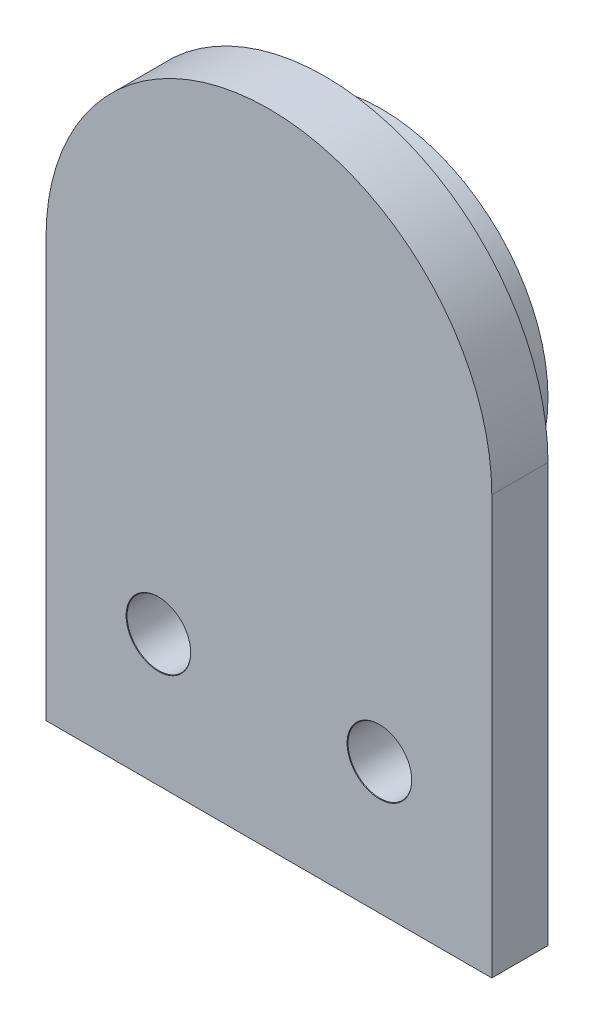
ISO-10303-21;
HEADER;
FILE_DESCRIPTION(('STEP AP214'),'2;1');
FILE_NAME('part.step','',(''),(''),'','','');
FILE_SCHEMA(('AUTOMOTIVE_DESIGN { 1 0 10303 214 1 1 1 1 }'));
ENDSEC;
DATA;
#1=APPLICATION_CONTEXT('core data for automotive mechanical design processes');
#2=APPLICATION_PROTOCOL_DEFINITION('international standard','automotive_design',2000,#1);
#3=PRODUCT_CONTEXT('',#1,'mechanical');
#4=PRODUCT('Part','Part','',(#3));
#5=PRODUCT_RELATED_PRODUCT_CATEGORY('part','',(#4));
#6=PRODUCT_DEFINITION_FORMATION('','',#4);
#7=PRODUCT_DEFINITION_CONTEXT('part definition',#1,'design');
#8=PRODUCT_DEFINITION('design','',#6,#7);
#9=PRODUCT_DEFINITION_SHAPE('','',#8);
#10=(LENGTH_UNIT() NAMED_UNIT(*) SI_UNIT(.MILLI.,.METRE.));
#11=(NAMED_UNIT(*) PLANE_ANGLE_UNIT() SI_UNIT($,.RADIAN.));
#12=(NAMED_UNIT(*) SI_UNIT($,.STERADIAN.) SOLID_ANGLE_UNIT());
#13=UNCERTAINTY_MEASURE_WITH_UNIT(LENGTH_MEASURE(1.E-05),#10,'distance_accuracy_value','');
#14=(GEOMETRIC_REPRESENTATION_CONTEXT(3) GLOBAL_UNCERTAINTY_ASSIGNED_CONTEXT((#13)) GLOBAL_UNIT_ASSIGNED_CONTEXT((#10,
#11,#12)) REPRESENTATION_CONTEXT('',''));
#15=CARTESIAN_POINT('',(0.,0.,0.));
#16=DIRECTION('',(0.,0.,1.));
#17=DIRECTION('',(1.,0.,0.));
#18=AXIS2_PLACEMENT_3D('',#15,#16,#17);
#19=CARTESIAN_POINT('',(0.,0.,3.));
#20=DIRECTION('',(0.,0.,-1.));
#21=DIRECTION('',(-1.,0.,0.));
#22=AXIS2_PLACEMENT_3D('',#19,#20,#21);
#23=CYLINDRICAL_SURFACE('',#22,11.9);
#24=CARTESIAN_POINT('',(0.,0.,0.));
#25=DIRECTION('',(0.,0.,1.));
#26=DIRECTION('',(1.,0.,0.));
#27=AXIS2_PLACEMENT_3D('',#24,#25,#26);
#28=CIRCLE('',#27,11.9);
#29=CARTESIAN_POINT('',(11.9,0.,0.));
#30=VERTEX_POINT('',#29);
#31=CARTESIAN_POINT('',(-11.9,0.,0.));
#32=VERTEX_POINT('',#31);
#33=EDGE_CURVE('E105',#30,#32,#28,.T.);
#34=ORIENTED_EDGE('',*,*,#33,.T.);
#35=DIRECTION('',(0.,0.,-1.));
#36=VECTOR('',#35,1.);
#37=CARTESIAN_POINT('',(-11.9,0.,3.));
#38=LINE('',#37,#36);
#39=CARTESIAN_POINT('',(-11.9,0.,3.));
#40=VERTEX_POINT('',#39);
#41=EDGE_CURVE('E96',#40,#32,#38,.T.);
#42=ORIENTED_EDGE('',*,*,#41,.F.);
#43=CARTESIAN_POINT('',(0.,0.,3.));
#44=DIRECTION('',(0.,0.,1.));
#45=DIRECTION('',(1.,0.,0.));
#46=AXIS2_PLACEMENT_3D('',#43,#44,#45);
#47=CIRCLE('',#46,11.9);
#48=CARTESIAN_POINT('',(11.9,0.,3.));
#49=VERTEX_POINT('',#48);
#50=EDGE_CURVE('E90',#49,#40,#47,.T.);
#51=ORIENTED_EDGE('',*,*,#50,.F.);
#52=DIRECTION('',(0.,0.,-1.));
#53=VECTOR('',#52,1.);
#54=CARTESIAN_POINT('',(11.9,0.,3.));
#55=LINE('',#54,#53);
#56=EDGE_CURVE('E101',#49,#30,#55,.T.);
#57=ORIENTED_EDGE('',*,*,#56,.T.);
#58=EDGE_LOOP('',(#34,#42,#51,#57));
#59=FACE_BOUND('',#58,.T.);
#60=ADVANCED_FACE('F36',(#59),#23,.T.);
#61=CARTESIAN_POINT('',(-11.9,0.,3.));
#62=DIRECTION('',(1.,0.,0.));
#63=DIRECTION('',(0.,0.,-1.));
#64=AXIS2_PLACEMENT_3D('',#61,#62,#63);
#65=PLANE('',#64);
#66=DIRECTION('',(0.,-1.,0.));
#67=VECTOR('',#66,1.);
#68=CARTESIAN_POINT('',(-11.9,0.,0.));
#69=LINE('',#68,#67);
#70=CARTESIAN_POINT('',(-11.9,-22.34,0.));
#71=VERTEX_POINT('',#70);
#72=EDGE_CURVE('E95',#32,#71,#69,.T.);
#73=ORIENTED_EDGE('',*,*,#72,.T.);
#74=DIRECTION('',(0.,0.,-1.));
#75=VECTOR('',#74,1.);
#76=CARTESIAN_POINT('',(-11.9,-22.34,3.));
#77=LINE('',#76,#75);
#78=CARTESIAN_POINT('',(-11.9,-22.34,3.));
#79=VERTEX_POINT('',#78);
#80=EDGE_CURVE('E93',#79,#71,#77,.T.);
#81=ORIENTED_EDGE('',*,*,#80,.F.);
#82=DIRECTION('',(0.,-1.,0.));
#83=VECTOR('',#82,1.);
#84=CARTESIAN_POINT('',(-11.9,0.,3.));
#85=LINE('',#84,#83);
#86=EDGE_CURVE('E85',#40,#79,#85,.T.);
#87=ORIENTED_EDGE('',*,*,#86,.F.);
#88=ORIENTED_EDGE('',*,*,#41,.T.);
#89=EDGE_LOOP('',(#73,#81,#87,#88));
#90=FACE_BOUND('',#89,.T.);
#91=ADVANCED_FACE('F94',(#90),#65,.F.);
#92=CARTESIAN_POINT('',(-11.9,-22.34,3.));
#93=DIRECTION('',(0.,1.,0.));
#94=DIRECTION('',(0.,0.,1.));
#95=AXIS2_PLACEMENT_3D('',#92,#93,#94);
#96=PLANE('',#95);
#97=DIRECTION('',(1.,0.,0.));
#98=VECTOR('',#97,1.);
#99=CARTESIAN_POINT('',(-11.9,-22.34,0.));
#100=LINE('',#99,#98);
#101=CARTESIAN_POINT('',(11.9,-22.34,0.));
#102=VERTEX_POINT('',#101);
#103=EDGE_CURVE('E71',#71,#102,#100,.T.);
#104=ORIENTED_EDGE('',*,*,#103,.T.);
#105=DIRECTION('',(0.,0.,-1.));
#106=VECTOR('',#105,1.);
#107=CARTESIAN_POINT('',(11.9,-22.34,3.));
#108=LINE('',#107,#106);
#109=CARTESIAN_POINT('',(11.9,-22.34,3.));
#110=VERTEX_POINT('',#109);
#111=EDGE_CURVE('E97',#110,#102,#108,.T.);
#112=ORIENTED_EDGE('',*,*,#111,.F.);
#113=DIRECTION('',(1.,0.,0.));
#114=VECTOR('',#113,1.);
#115=CARTESIAN_POINT('',(-11.9,-22.34,3.));
#116=LINE('',#115,#114);
#117=EDGE_CURVE('E88',#79,#110,#116,.T.);
#118=ORIENTED_EDGE('',*,*,#117,.F.);
#119=ORIENTED_EDGE('',*,*,#80,.T.);
#120=EDGE_LOOP('',(#104,#112,#118,#119));
#121=FACE_BOUND('',#120,.T.);
#122=ADVANCED_FACE('F99',(#121),#96,.F.);
#123=CARTESIAN_POINT('',(11.9,-22.34,3.));
#124=DIRECTION('',(-1.,0.,0.));
#125=DIRECTION('',(0.,0.,1.));
#126=AXIS2_PLACEMENT_3D('',#123,#124,#125);
#127=PLANE('',#126);
#128=DIRECTION('',(0.,1.,0.));
#129=VECTOR('',#128,1.);
#130=CARTESIAN_POINT('',(11.9,-22.34,0.));
#131=LINE('',#130,#129);
#132=EDGE_CURVE('E77',#102,#30,#131,.T.);
#133=ORIENTED_EDGE('',*,*,#132,.T.);
#134=ORIENTED_EDGE('',*,*,#56,.F.);
#135=DIRECTION('',(0.,1.,0.));
#136=VECTOR('',#135,1.);
#137=CARTESIAN_POINT('',(11.9,-22.34,3.));
#138=LINE('',#137,#136);
#139=EDGE_CURVE('E54',#110,#49,#138,.T.);
#140=ORIENTED_EDGE('',*,*,#139,.F.);
#141=ORIENTED_EDGE('',*,*,#111,.T.);
#142=EDGE_LOOP('',(#133,#134,#140,#141));
#143=FACE_BOUND('',#142,.T.);
#144=ADVANCED_FACE('F145',(#143),#127,.F.);
#145=CARTESIAN_POINT('',(0.,0.,3.));
#146=DIRECTION('',(0.,0.,1.));
#147=DIRECTION('',(1.,0.,0.));
#148=AXIS2_PLACEMENT_3D('',#145,#146,#147);
#149=PLANE('',#148);
#150=CARTESIAN_POINT('',(-5.9,-15.34,3.));
#151=DIRECTION('',(0.,0.,1.));
#152=DIRECTION('',(1.,0.,0.));
#153=AXIS2_PLACEMENT_3D('',#150,#151,#152);
#154=CIRCLE('',#153,1.725);
#155=CARTESIAN_POINT('',(-4.175,-15.34,3.));
#156=VERTEX_POINT('',#155);
#157=EDGE_CURVE('E303',#156,#156,#154,.T.);
#158=ORIENTED_EDGE('',*,*,#157,.F.);
#159=EDGE_LOOP('',(#158));
#160=FACE_BOUND('',#159,.T.);
#161=CARTESIAN_POINT('',(5.9,-15.34,3.));
#162=DIRECTION('',(0.,0.,1.));
#163=DIRECTION('',(1.,0.,0.));
#164=AXIS2_PLACEMENT_3D('',#161,#162,#163);
#165=CIRCLE('',#164,1.725);
#166=CARTESIAN_POINT('',(7.625,-15.34,3.));
#167=VERTEX_POINT('',#166);
#168=EDGE_CURVE('E123',#167,#167,#165,.T.);
#169=ORIENTED_EDGE('',*,*,#168,.F.);
#170=EDGE_LOOP('',(#169));
#171=FACE_BOUND('',#170,.T.);
#172=ORIENTED_EDGE('',*,*,#50,.T.);
#173=ORIENTED_EDGE('',*,*,#86,.T.);
#174=ORIENTED_EDGE('',*,*,#117,.T.);
#175=ORIENTED_EDGE('',*,*,#139,.T.);
#176=EDGE_LOOP('',(#172,#173,#174,#175));
#177=FACE_BOUND('',#176,.T.);
#178=ADVANCED_FACE('F86',(#160,#171,#177),#149,.T.);
#179=CARTESIAN_POINT('',(0.,0.,0.));
#180=DIRECTION('',(0.,0.,1.));
#181=DIRECTION('',(1.,0.,0.));
#182=AXIS2_PLACEMENT_3D('',#179,#180,#181);
#183=PLANE('',#182);
#184=CARTESIAN_POINT('',(-5.9,-15.34,0.));
#185=DIRECTION('',(0.,0.,1.));
#186=DIRECTION('',(1.,0.,0.));
#187=AXIS2_PLACEMENT_3D('',#184,#185,#186);
#188=CIRCLE('',#187,1.7);
#189=CARTESIAN_POINT('',(-4.2,-15.34,0.));
#190=VERTEX_POINT('',#189);
#191=EDGE_CURVE('E39',#190,#190,#188,.T.);
#192=ORIENTED_EDGE('',*,*,#191,.T.);
#193=EDGE_LOOP('',(#192));
#194=FACE_BOUND('',#193,.T.);
#195=CARTESIAN_POINT('',(5.9,-15.34,0.));
#196=DIRECTION('',(0.,0.,1.));
#197=DIRECTION('',(1.,0.,0.));
#198=AXIS2_PLACEMENT_3D('',#195,#196,#197);
#199=CIRCLE('',#198,1.7);
#200=CARTESIAN_POINT('',(7.6,-15.34,0.));
#201=VERTEX_POINT('',#200);
#202=EDGE_CURVE('E114',#201,#201,#199,.T.);
#203=ORIENTED_EDGE('',*,*,#202,.T.);
#204=EDGE_LOOP('',(#203));
#205=FACE_BOUND('',#204,.T.);
#206=CARTESIAN_POINT('',(0.,0.,0.));
#207=DIRECTION('',(0.,0.,-1.));
#208=DIRECTION('',(-1.,0.,0.));
#209=AXIS2_PLACEMENT_3D('',#206,#207,#208);
#210=CIRCLE('',#209,8.9);
#211=CARTESIAN_POINT('',(-8.9,0.,0.));
#212=VERTEX_POINT('',#211);
#213=EDGE_CURVE('E45',#212,#212,#210,.T.);
#214=ORIENTED_EDGE('',*,*,#213,.F.);
#215=EDGE_LOOP('',(#214));
#216=FACE_BOUND('',#215,.T.);
#217=ORIENTED_EDGE('',*,*,#33,.F.);
#218=ORIENTED_EDGE('',*,*,#132,.F.);
#219=ORIENTED_EDGE('',*,*,#103,.F.);
#220=ORIENTED_EDGE('',*,*,#72,.F.);
#221=EDGE_LOOP('',(#217,#218,#219,#220));
#222=FACE_BOUND('',#221,.T.);
#223=ADVANCED_FACE('F138',(#194,#205,#216,#222),#183,.F.);
#224=CARTESIAN_POINT('',(0.,0.,-3.));
#225=DIRECTION('',(0.,0.,1.));
#226=DIRECTION('',(1.,0.,0.));
#227=AXIS2_PLACEMENT_3D('',#224,#225,#226);
#228=CYLINDRICAL_SURFACE('',#227,8.9);
#229=CARTESIAN_POINT('',(0.,0.,-3.));
#230=DIRECTION('',(0.,0.,-1.));
#231=DIRECTION('',(-1.,0.,0.));
#232=AXIS2_PLACEMENT_3D('',#229,#230,#231);
#233=CIRCLE('',#232,8.9);
#234=CARTESIAN_POINT('',(-8.9,0.,-3.));
#235=VERTEX_POINT('',#234);
#236=EDGE_CURVE('E108',#235,#235,#233,.T.);
#237=ORIENTED_EDGE('',*,*,#236,.F.);
#238=EDGE_LOOP('',(#237));
#239=FACE_BOUND('',#238,.T.);
#240=ORIENTED_EDGE('',*,*,#213,.T.);
#241=EDGE_LOOP('',(#240));
#242=FACE_BOUND('',#241,.T.);
#243=ADVANCED_FACE('F136',(#239,#242),#228,.T.);
#244=CARTESIAN_POINT('',(0.,0.,-3.));
#245=DIRECTION('',(0.,0.,-1.));
#246=DIRECTION('',(-1.,0.,0.));
#247=AXIS2_PLACEMENT_3D('',#244,#245,#246);
#248=PLANE('',#247);
#249=CARTESIAN_POINT('',(0.,0.,-3.));
#250=DIRECTION('',(0.,0.,-1.));
#251=DIRECTION('',(-1.,0.,0.));
#252=AXIS2_PLACEMENT_3D('',#249,#250,#251);
#253=CIRCLE('',#252,2.);
#254=CARTESIAN_POINT('',(-2.,0.,-3.));
#255=VERTEX_POINT('',#254);
#256=EDGE_CURVE('E11',#255,#255,#253,.T.);
#257=ORIENTED_EDGE('',*,*,#256,.F.);
#258=EDGE_LOOP('',(#257));
#259=FACE_BOUND('',#258,.T.);
#260=ORIENTED_EDGE('',*,*,#236,.T.);
#261=EDGE_LOOP('',(#260));
#262=FACE_BOUND('',#261,.T.);
#263=ADVANCED_FACE('F181',(#259,#262),#248,.T.);
#264=CARTESIAN_POINT('',(0.,0.,-6.));
#265=DIRECTION('',(0.,0.,1.));
#266=DIRECTION('',(1.,0.,0.));
#267=AXIS2_PLACEMENT_3D('',#264,#265,#266);
#268=CYLINDRICAL_SURFACE('',#267,2.);
#269=CARTESIAN_POINT('',(0.,0.,-6.));
#270=DIRECTION('',(0.,0.,-1.));
#271=DIRECTION('',(-1.,0.,0.));
#272=AXIS2_PLACEMENT_3D('',#269,#270,#271);
#273=CIRCLE('',#272,2.);
#274=CARTESIAN_POINT('',(-2.,0.,-6.));
#275=VERTEX_POINT('',#274);
#276=EDGE_CURVE('E116',#275,#275,#273,.T.);
#277=ORIENTED_EDGE('',*,*,#276,.F.);
#278=EDGE_LOOP('',(#277));
#279=FACE_BOUND('',#278,.T.);
#280=ORIENTED_EDGE('',*,*,#256,.T.);
#281=EDGE_LOOP('',(#280));
#282=FACE_BOUND('',#281,.T.);
#283=ADVANCED_FACE('F193',(#279,#282),#268,.T.);
#284=CARTESIAN_POINT('',(0.,0.,-6.));
#285=DIRECTION('',(0.,0.,-1.));
#286=DIRECTION('',(-1.,0.,0.));
#287=AXIS2_PLACEMENT_3D('',#284,#285,#286);
#288=PLANE('',#287);
#289=ORIENTED_EDGE('',*,*,#276,.T.);
#290=EDGE_LOOP('',(#289));
#291=FACE_BOUND('',#290,.T.);
#292=ADVANCED_FACE('F204',(#291),#288,.T.);
#293=CARTESIAN_POINT('',(5.9,-15.34,3.));
#294=DIRECTION('',(0.,0.,1.));
#295=DIRECTION('',(1.,0.,0.));
#296=AXIS2_PLACEMENT_3D('',#293,#294,#295);
#297=CYLINDRICAL_SURFACE('',#296,1.7);
#298=CARTESIAN_POINT('',(5.9,-15.34,2.975));
#299=DIRECTION('',(0.,0.,1.));
#300=DIRECTION('',(1.,0.,0.));
#301=AXIS2_PLACEMENT_3D('',#298,#299,#300);
#302=CIRCLE('',#301,1.7);
#303=CARTESIAN_POINT('',(7.6,-15.34,2.975));
#304=VERTEX_POINT('',#303);
#305=EDGE_CURVE('E117',#304,#304,#302,.T.);
#306=ORIENTED_EDGE('',*,*,#305,.T.);
#307=EDGE_LOOP('',(#306));
#308=FACE_BOUND('',#307,.T.);
#309=ORIENTED_EDGE('',*,*,#202,.F.);
#310=EDGE_LOOP('',(#309));
#311=FACE_BOUND('',#310,.T.);
#312=ADVANCED_FACE('F215',(#308,#311),#297,.F.);
#313=CARTESIAN_POINT('',(5.9,-15.34,3.));
#314=DIRECTION('',(0.,0.,1.));
#315=DIRECTION('',(1.,0.,0.));
#316=AXIS2_PLACEMENT_3D('',#313,#314,#315);
#317=CONICAL_SURFACE('',#316,1.725,0.785398163397431);
#318=ORIENTED_EDGE('',*,*,#305,.F.);
#319=EDGE_LOOP('',(#318));
#320=FACE_BOUND('',#319,.T.);
#321=ORIENTED_EDGE('',*,*,#168,.T.);
#322=EDGE_LOOP('',(#321));
#323=FACE_BOUND('',#322,.T.);
#324=ADVANCED_FACE('F238',(#320,#323),#317,.F.);
#325=CARTESIAN_POINT('',(-5.9,-15.34,3.));
#326=DIRECTION('',(0.,0.,1.));
#327=DIRECTION('',(1.,0.,0.));
#328=AXIS2_PLACEMENT_3D('',#325,#326,#327);
#329=CYLINDRICAL_SURFACE('',#328,1.7);
#330=CARTESIAN_POINT('',(-5.9,-15.34,2.975));
#331=DIRECTION('',(0.,0.,1.));
#332=DIRECTION('',(1.,0.,0.));
#333=AXIS2_PLACEMENT_3D('',#330,#331,#332);
#334=CIRCLE('',#333,1.7);
#335=CARTESIAN_POINT('',(-4.2,-15.34,2.975));
#336=VERTEX_POINT('',#335);
#337=EDGE_CURVE('E300',#336,#336,#334,.T.);
#338=ORIENTED_EDGE('',*,*,#337,.T.);
#339=EDGE_LOOP('',(#338));
#340=FACE_BOUND('',#339,.T.);
#341=ORIENTED_EDGE('',*,*,#191,.F.);
#342=EDGE_LOOP('',(#341));
#343=FACE_BOUND('',#342,.T.);
#344=ADVANCED_FACE('F248',(#340,#343),#329,.F.);
#345=CARTESIAN_POINT('',(-5.9,-15.34,3.));
#346=DIRECTION('',(0.,0.,1.));
#347=DIRECTION('',(1.,0.,0.));
#348=AXIS2_PLACEMENT_3D('',#345,#346,#347);
#349=CONICAL_SURFACE('',#348,1.725,0.785398163397431);
#350=ORIENTED_EDGE('',*,*,#337,.F.);
#351=EDGE_LOOP('',(#350));
#352=FACE_BOUND('',#351,.T.);
#353=ORIENTED_EDGE('',*,*,#157,.T.);
#354=EDGE_LOOP('',(#353));
#355=FACE_BOUND('',#354,.T.);
#356=ADVANCED_FACE('F259',(#352,#355),#349,.F.);
#357=CLOSED_SHELL('',(#60,#91,#122,#144,#178,#223,#243,#263,#283,#292,#312,#324,#344,#356));
#358=MANIFOLD_SOLID_BREP('B2',#357);
#359=ADVANCED_BREP_SHAPE_REPRESENTATION('',(#18,#358),#14);
#360=SHAPE_DEFINITION_REPRESENTATION(#9,#359);
ENDSEC;
END-ISO-10303-21;
